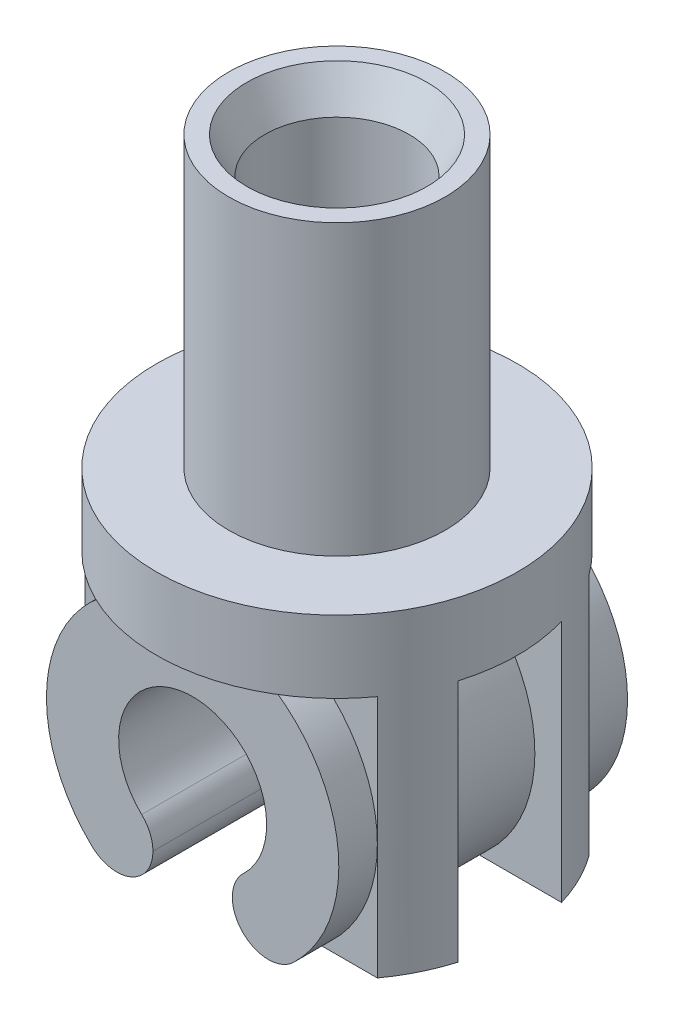
ISO-10303-21;
HEADER;
FILE_DESCRIPTION(('STEP AP214'),'2;1');
FILE_NAME('part.step','',(''),(''),'','','');
FILE_SCHEMA(('AUTOMOTIVE_DESIGN { 1 0 10303 214 1 1 1 1 }'));
ENDSEC;
DATA;
#1=APPLICATION_CONTEXT('core data for automotive mechanical design processes');
#2=APPLICATION_PROTOCOL_DEFINITION('international standard','automotive_design',2000,#1);
#3=PRODUCT_CONTEXT('',#1,'mechanical');
#4=PRODUCT('Part','Part','',(#3));
#5=PRODUCT_RELATED_PRODUCT_CATEGORY('part','',(#4));
#6=PRODUCT_DEFINITION_FORMATION('','',#4);
#7=PRODUCT_DEFINITION_CONTEXT('part definition',#1,'design');
#8=PRODUCT_DEFINITION('design','',#6,#7);
#9=PRODUCT_DEFINITION_SHAPE('','',#8);
#10=(LENGTH_UNIT() NAMED_UNIT(*) SI_UNIT(.MILLI.,.METRE.));
#11=(NAMED_UNIT(*) PLANE_ANGLE_UNIT() SI_UNIT($,.RADIAN.));
#12=(NAMED_UNIT(*) SI_UNIT($,.STERADIAN.) SOLID_ANGLE_UNIT());
#13=UNCERTAINTY_MEASURE_WITH_UNIT(LENGTH_MEASURE(1.E-05),#10,'distance_accuracy_value','');
#14=(GEOMETRIC_REPRESENTATION_CONTEXT(3) GLOBAL_UNCERTAINTY_ASSIGNED_CONTEXT((#13)) GLOBAL_UNIT_ASSIGNED_CONTEXT((#10,
#11,#12)) REPRESENTATION_CONTEXT('',''));
#15=CARTESIAN_POINT('',(0.,0.,0.));
#16=DIRECTION('',(0.,0.,1.));
#17=DIRECTION('',(1.,0.,0.));
#18=AXIS2_PLACEMENT_3D('',#15,#16,#17);
#19=CARTESIAN_POINT('',(3.927828813628,-7.7504869247949,6.62409702745333));
#20=DIRECTION('',(0.,0.,1.));
#21=DIRECTION('',(1.,0.,0.));
#22=AXIS2_PLACEMENT_3D('',#19,#20,#21);
#23=CYLINDRICAL_SURFACE('',#22,1.);
#24=CARTESIAN_POINT('',(3.927828813628,-7.7504869247949,20.1878195071953));
#25=DIRECTION('',(0.,0.,1.));
#26=DIRECTION('',(1.,0.,0.));
#27=AXIS2_PLACEMENT_3D('',#24,#25,#26);
#28=CIRCLE('',#27,1.);
#29=CARTESIAN_POINT('',(4.61635340379194,-8.47569992022423,20.1878195071953));
#30=VERTEX_POINT('',#29);
#31=CARTESIAN_POINT('',(3.92782881362801,-8.7504869247949,20.1878195071953));
#32=VERTEX_POINT('',#31);
#33=EDGE_CURVE('E298',#30,#32,#28,.F.);
#34=ORIENTED_EDGE('',*,*,#33,.F.);
#35=DIRECTION('',(0.,0.,1.));
#36=VECTOR('',#35,1.);
#37=CARTESIAN_POINT('',(4.61635340379194,-8.47569992022423,6.62409702745333));
#38=LINE('',#37,#36);
#39=CARTESIAN_POINT('',(4.61635340379194,-8.47569992022423,23.0521182717536));
#40=VERTEX_POINT('',#39);
#41=EDGE_CURVE('E480',#40,#30,#38,.F.);
#42=ORIENTED_EDGE('',*,*,#41,.F.);
#43=CARTESIAN_POINT('',(3.927828813628,-7.7504869247949,23.0521182717536));
#44=DIRECTION('',(0.,0.,1.));
#45=DIRECTION('',(1.,0.,0.));
#46=AXIS2_PLACEMENT_3D('',#43,#44,#45);
#47=CIRCLE('',#46,1.);
#48=CARTESIAN_POINT('',(3.92782881362801,-8.7504869247949,23.0521182717536));
#49=VERTEX_POINT('',#48);
#50=EDGE_CURVE('E315',#40,#49,#47,.F.);
#51=ORIENTED_EDGE('',*,*,#50,.T.);
#52=DIRECTION('',(0.,0.,1.));
#53=VECTOR('',#52,1.);
#54=CARTESIAN_POINT('',(3.92782881362801,-8.7504869247949,21.082852444629));
#55=LINE('',#54,#53);
#56=CARTESIAN_POINT('',(3.92782881362801,-8.7504869247949,24.5521182717536));
#57=VERTEX_POINT('',#56);
#58=EDGE_CURVE('E316',#49,#57,#55,.T.);
#59=ORIENTED_EDGE('',*,*,#58,.T.);
#60=CARTESIAN_POINT('',(3.927828813628,-7.7504869247949,24.5521182717536));
#61=DIRECTION('',(0.,0.,-1.));
#62=DIRECTION('',(-1.,0.,0.));
#63=AXIS2_PLACEMENT_3D('',#60,#61,#62);
#64=CIRCLE('',#63,1.);
#65=CARTESIAN_POINT('',(4.61635340379194,-8.47569992022423,24.5521182717536));
#66=VERTEX_POINT('',#65);
#67=EDGE_CURVE('E324',#57,#66,#64,.F.);
#68=ORIENTED_EDGE('',*,*,#67,.T.);
#69=CARTESIAN_POINT('',(4.61635340379194,-8.47569992022423,25.6199688894745));
#70=VERTEX_POINT('',#69);
#71=EDGE_CURVE('E478',#70,#66,#38,.F.);
#72=ORIENTED_EDGE('',*,*,#71,.F.);
#73=CARTESIAN_POINT('',(3.927828813628,-7.7504869247949,25.6199688894745));
#74=DIRECTION('',(0.,0.,1.));
#75=DIRECTION('',(1.,0.,0.));
#76=AXIS2_PLACEMENT_3D('',#73,#74,#75);
#77=CIRCLE('',#76,1.);
#78=CARTESIAN_POINT('',(2.927828813628,-7.7504869247949,25.6199688894745));
#79=VERTEX_POINT('',#78);
#80=EDGE_CURVE('E459',#79,#70,#77,.T.);
#81=ORIENTED_EDGE('',*,*,#80,.F.);
#82=DIRECTION('',(0.,0.,1.));
#83=VECTOR('',#82,1.);
#84=CARTESIAN_POINT('',(2.927828813628,-7.7504869247949,6.62409702745333));
#85=LINE('',#84,#83);
#86=CARTESIAN_POINT('',(2.927828813628,-7.7504869247949,17.6199688894745));
#87=VERTEX_POINT('',#86);
#88=EDGE_CURVE('E51',#87,#79,#85,.T.);
#89=ORIENTED_EDGE('',*,*,#88,.F.);
#90=CARTESIAN_POINT('',(3.927828813628,-7.7504869247949,17.6199688894745));
#91=DIRECTION('',(0.,0.,1.));
#92=DIRECTION('',(1.,0.,0.));
#93=AXIS2_PLACEMENT_3D('',#90,#91,#92);
#94=CIRCLE('',#93,1.);
#95=CARTESIAN_POINT('',(4.61635340379194,-8.47569992022423,17.6199688894745));
#96=VERTEX_POINT('',#95);
#97=EDGE_CURVE('E473',#96,#87,#94,.F.);
#98=ORIENTED_EDGE('',*,*,#97,.F.);
#99=CARTESIAN_POINT('',(4.61635340379194,-8.47569992022423,18.6878195071953));
#100=VERTEX_POINT('',#99);
#101=EDGE_CURVE('E477',#100,#96,#38,.F.);
#102=ORIENTED_EDGE('',*,*,#101,.F.);
#103=CARTESIAN_POINT('',(3.927828813628,-7.7504869247949,18.6878195071953));
#104=DIRECTION('',(0.,0.,1.));
#105=DIRECTION('',(1.,0.,0.));
#106=AXIS2_PLACEMENT_3D('',#103,#104,#105);
#107=CIRCLE('',#106,1.);
#108=CARTESIAN_POINT('',(3.92782881362801,-8.7504869247949,18.6878195071953));
#109=VERTEX_POINT('',#108);
#110=EDGE_CURVE('E288',#100,#109,#107,.F.);
#111=ORIENTED_EDGE('',*,*,#110,.T.);
#112=DIRECTION('',(0.,0.,1.));
#113=VECTOR('',#112,1.);
#114=CARTESIAN_POINT('',(3.92782881362801,-8.7504869247949,16.7185536800707));
#115=LINE('',#114,#113);
#116=EDGE_CURVE('E292',#109,#32,#115,.T.);
#117=ORIENTED_EDGE('',*,*,#116,.T.);
#118=EDGE_LOOP('',(#34,#42,#51,#59,#68,#72,#81,#89,#98,#102,#111,#117));
#119=FACE_BOUND('',#118,.T.);
#120=ADVANCED_FACE('F48',(#119),#23,.T.);
#121=CARTESIAN_POINT('',(1.827828813628,-5.53858728873544,6.62409702745333));
#122=DIRECTION('',(0.,0.,1.));
#123=DIRECTION('',(1.,0.,0.));
#124=AXIS2_PLACEMENT_3D('',#121,#122,#123);
#125=CYLINDRICAL_SURFACE('',#124,4.05);
#126=DIRECTION('',(0.,0.,1.));
#127=VECTOR('',#126,1.);
#128=CARTESIAN_POINT('',(-0.960695776535936,-8.47569992022423,6.62409702745333));
#129=LINE('',#128,#127);
#130=CARTESIAN_POINT('',(-0.960695776535935,-8.47569992022423,20.1878195071953));
#131=VERTEX_POINT('',#130);
#132=CARTESIAN_POINT('',(-0.960695776535935,-8.47569992022423,23.0521182717536));
#133=VERTEX_POINT('',#132);
#134=EDGE_CURVE('E56',#131,#133,#129,.T.);
#135=ORIENTED_EDGE('',*,*,#134,.T.);
#136=CARTESIAN_POINT('',(1.827828813628,-5.53858728873544,23.0521182717536));
#137=DIRECTION('',(0.,0.,1.));
#138=DIRECTION('',(1.,0.,0.));
#139=AXIS2_PLACEMENT_3D('',#136,#137,#138);
#140=CIRCLE('',#139,4.05);
#141=CARTESIAN_POINT('',(-0.142171186372,-2.,23.0521182717536));
#142=VERTEX_POINT('',#141);
#143=EDGE_CURVE('E389',#142,#133,#140,.T.);
#144=ORIENTED_EDGE('',*,*,#143,.F.);
#145=DIRECTION('',(0.,0.,-1.));
#146=VECTOR('',#145,1.);
#147=CARTESIAN_POINT('',(-0.142171186372,-2.,0.));
#148=LINE('',#147,#146);
#149=CARTESIAN_POINT('',(-0.142171186372,-2.,20.1878195071953));
#150=VERTEX_POINT('',#149);
#151=EDGE_CURVE('E444',#142,#150,#148,.T.);
#152=ORIENTED_EDGE('',*,*,#151,.T.);
#153=CARTESIAN_POINT('',(1.827828813628,-5.53858728873544,20.1878195071953));
#154=DIRECTION('',(0.,0.,1.));
#155=DIRECTION('',(1.,0.,0.));
#156=AXIS2_PLACEMENT_3D('',#153,#154,#155);
#157=CIRCLE('',#156,4.05);
#158=EDGE_CURVE('E378',#150,#131,#157,.T.);
#159=ORIENTED_EDGE('',*,*,#158,.T.);
#160=EDGE_LOOP('',(#135,#144,#152,#159));
#161=FACE_BOUND('',#160,.T.);
#162=ADVANCED_FACE('F520',(#161),#125,.T.);
#163=CARTESIAN_POINT('',(-0.960695776535936,-8.47569992022423,17.6199688894745));
#164=VERTEX_POINT('',#163);
#165=CARTESIAN_POINT('',(-0.960695776535935,-8.47569992022423,18.6878195071953));
#166=VERTEX_POINT('',#165);
#167=EDGE_CURVE('E13',#164,#166,#129,.T.);
#168=ORIENTED_EDGE('',*,*,#167,.T.);
#169=CARTESIAN_POINT('',(1.827828813628,-5.53858728873544,18.6878195071953));
#170=DIRECTION('',(0.,0.,1.));
#171=DIRECTION('',(1.,0.,0.));
#172=AXIS2_PLACEMENT_3D('',#169,#170,#171);
#173=CIRCLE('',#172,4.05);
#174=CARTESIAN_POINT('',(-2.222171186372,-5.53858728873544,18.6878195071953));
#175=VERTEX_POINT('',#174);
#176=EDGE_CURVE('E347',#166,#175,#173,.F.);
#177=ORIENTED_EDGE('',*,*,#176,.T.);
#178=CARTESIAN_POINT('',(1.827828813628,-5.53858728873544,18.6878195071953));
#179=DIRECTION('',(0.,0.,1.));
#180=DIRECTION('',(1.,0.,0.));
#181=AXIS2_PLACEMENT_3D('',#178,#179,#180);
#182=CIRCLE('',#181,4.05);
#183=CARTESIAN_POINT('',(-0.142171186372,-2.,18.6878195071953));
#184=VERTEX_POINT('',#183);
#185=EDGE_CURVE('E377',#184,#175,#182,.T.);
#186=ORIENTED_EDGE('',*,*,#185,.F.);
#187=CARTESIAN_POINT('',(-0.142171186372,-2.,17.6199688894745));
#188=VERTEX_POINT('',#187);
#189=EDGE_CURVE('E431',#184,#188,#148,.T.);
#190=ORIENTED_EDGE('',*,*,#189,.T.);
#191=CARTESIAN_POINT('',(1.827828813628,-5.53858728873544,17.6199688894745));
#192=DIRECTION('',(0.,0.,1.));
#193=DIRECTION('',(1.,0.,0.));
#194=AXIS2_PLACEMENT_3D('',#191,#192,#193);
#195=CIRCLE('',#194,4.05);
#196=EDGE_CURVE('E401',#164,#188,#195,.F.);
#197=ORIENTED_EDGE('',*,*,#196,.F.);
#198=EDGE_LOOP('',(#168,#177,#186,#190,#197));
#199=FACE_BOUND('',#198,.T.);
#200=ADVANCED_FACE('F537',(#199),#125,.T.);
#201=CARTESIAN_POINT('',(1.827828813628,-5.53858728873544,6.62409702745333));
#202=DIRECTION('',(0.,0.,1.));
#203=DIRECTION('',(1.,0.,0.));
#204=AXIS2_PLACEMENT_3D('',#201,#202,#203);
#205=CYLINDRICAL_SURFACE('',#204,2.05);
#206=CARTESIAN_POINT('',(1.827828813628,-5.53858728873544,25.6199688894745));
#207=DIRECTION('',(0.,0.,1.));
#208=DIRECTION('',(1.,0.,0.));
#209=AXIS2_PLACEMENT_3D('',#206,#207,#208);
#210=CIRCLE('',#209,2.05);
#211=CARTESIAN_POINT('',(3.23930422346407,-7.02527392936557,25.6199688894745));
#212=VERTEX_POINT('',#211);
#213=CARTESIAN_POINT('',(0.416353403791934,-7.02527392936557,25.6199688894745));
#214=VERTEX_POINT('',#213);
#215=EDGE_CURVE('E406',#212,#214,#210,.T.);
#216=ORIENTED_EDGE('',*,*,#215,.T.);
#217=DIRECTION('',(0.,0.,1.));
#218=VECTOR('',#217,1.);
#219=CARTESIAN_POINT('',(0.416353403791934,-7.02527392936557,6.62409702745333));
#220=LINE('',#219,#218);
#221=CARTESIAN_POINT('',(0.416353403791934,-7.02527392936557,17.6199688894745));
#222=VERTEX_POINT('',#221);
#223=EDGE_CURVE('E466',#214,#222,#220,.F.);
#224=ORIENTED_EDGE('',*,*,#223,.T.);
#225=CARTESIAN_POINT('',(1.827828813628,-5.53858728873544,17.6199688894745));
#226=DIRECTION('',(0.,0.,1.));
#227=DIRECTION('',(1.,0.,0.));
#228=AXIS2_PLACEMENT_3D('',#225,#226,#227);
#229=CIRCLE('',#228,2.05);
#230=CARTESIAN_POINT('',(3.23930422346407,-7.02527392936557,17.6199688894745));
#231=VERTEX_POINT('',#230);
#232=EDGE_CURVE('E402',#222,#231,#229,.F.);
#233=ORIENTED_EDGE('',*,*,#232,.T.);
#234=DIRECTION('',(0.,0.,1.));
#235=VECTOR('',#234,1.);
#236=CARTESIAN_POINT('',(3.23930422346407,-7.02527392936557,6.62409702745333));
#237=LINE('',#236,#235);
#238=EDGE_CURVE('E463',#231,#212,#237,.T.);
#239=ORIENTED_EDGE('',*,*,#238,.T.);
#240=EDGE_LOOP('',(#216,#224,#233,#239));
#241=FACE_BOUND('',#240,.T.);
#242=ADVANCED_FACE('F554',(#241),#205,.F.);
#243=CARTESIAN_POINT('',(1.827828813628,-5.53858728873544,6.62409702745333));
#244=DIRECTION('',(0.,0.,1.));
#245=DIRECTION('',(1.,0.,0.));
#246=AXIS2_PLACEMENT_3D('',#243,#244,#245);
#247=CYLINDRICAL_SURFACE('',#246,4.05);
#248=CARTESIAN_POINT('',(1.827828813628,-5.53858728873544,23.0521182717536));
#249=DIRECTION('',(0.,0.,1.));
#250=DIRECTION('',(1.,0.,0.));
#251=AXIS2_PLACEMENT_3D('',#248,#249,#250);
#252=CIRCLE('',#251,4.05);
#253=CARTESIAN_POINT('',(3.797828813628,-2.,23.0521182717536));
#254=VERTEX_POINT('',#253);
#255=EDGE_CURVE('E356',#40,#254,#252,.T.);
#256=ORIENTED_EDGE('',*,*,#255,.F.);
#257=ORIENTED_EDGE('',*,*,#41,.T.);
#258=CARTESIAN_POINT('',(1.827828813628,-5.53858728873544,20.1878195071953));
#259=DIRECTION('',(0.,0.,1.));
#260=DIRECTION('',(1.,0.,0.));
#261=AXIS2_PLACEMENT_3D('',#258,#259,#260);
#262=CIRCLE('',#261,4.05);
#263=CARTESIAN_POINT('',(3.797828813628,-2.,20.1878195071953));
#264=VERTEX_POINT('',#263);
#265=EDGE_CURVE('E362',#30,#264,#262,.T.);
#266=ORIENTED_EDGE('',*,*,#265,.T.);
#267=DIRECTION('',(0.,0.,-1.));
#268=VECTOR('',#267,1.);
#269=CARTESIAN_POINT('',(3.797828813628,-2.,0.));
#270=LINE('',#269,#268);
#271=EDGE_CURVE('E438',#254,#264,#270,.T.);
#272=ORIENTED_EDGE('',*,*,#271,.F.);
#273=EDGE_LOOP('',(#256,#257,#266,#272));
#274=FACE_BOUND('',#273,.T.);
#275=ADVANCED_FACE('F593',(#274),#247,.T.);
#276=CARTESIAN_POINT('',(1.827828813628,-5.53858728873544,18.6878195071953));
#277=DIRECTION('',(0.,0.,1.));
#278=DIRECTION('',(1.,0.,0.));
#279=AXIS2_PLACEMENT_3D('',#276,#277,#278);
#280=CIRCLE('',#279,4.05);
#281=CARTESIAN_POINT('',(5.877828813628,-5.53858728873544,18.6878195071953));
#282=VERTEX_POINT('',#281);
#283=CARTESIAN_POINT('',(3.797828813628,-2.,18.6878195071953));
#284=VERTEX_POINT('',#283);
#285=EDGE_CURVE('E370',#282,#284,#280,.T.);
#286=ORIENTED_EDGE('',*,*,#285,.F.);
#287=CARTESIAN_POINT('',(1.827828813628,-5.53858728873544,18.6878195071953));
#288=DIRECTION('',(0.,0.,1.));
#289=DIRECTION('',(1.,0.,0.));
#290=AXIS2_PLACEMENT_3D('',#287,#288,#289);
#291=CIRCLE('',#290,4.05);
#292=EDGE_CURVE('E341',#282,#100,#291,.F.);
#293=ORIENTED_EDGE('',*,*,#292,.T.);
#294=ORIENTED_EDGE('',*,*,#101,.T.);
#295=CARTESIAN_POINT('',(1.827828813628,-5.53858728873544,17.6199688894745));
#296=DIRECTION('',(0.,0.,1.));
#297=DIRECTION('',(1.,0.,0.));
#298=AXIS2_PLACEMENT_3D('',#295,#296,#297);
#299=CIRCLE('',#298,4.05);
#300=CARTESIAN_POINT('',(3.797828813628,-2.,17.6199688894745));
#301=VERTEX_POINT('',#300);
#302=EDGE_CURVE('E398',#301,#96,#299,.F.);
#303=ORIENTED_EDGE('',*,*,#302,.F.);
#304=EDGE_CURVE('E439',#284,#301,#270,.T.);
#305=ORIENTED_EDGE('',*,*,#304,.F.);
#306=EDGE_LOOP('',(#286,#293,#294,#303,#305));
#307=FACE_BOUND('',#306,.T.);
#308=ADVANCED_FACE('F551',(#307),#247,.T.);
#309=CARTESIAN_POINT('',(1.827828813628,-2.,21.6199688894745));
#310=DIRECTION('',(0.,1.,0.));
#311=DIRECTION('',(0.,0.,1.));
#312=AXIS2_PLACEMENT_3D('',#309,#310,#311);
#313=PLANE('',#312);
#314=DIRECTION('',(1.,0.,0.));
#315=VECTOR('',#314,1.);
#316=CARTESIAN_POINT('',(0.,-2.,18.6878195071953));
#317=LINE('',#316,#315);
#318=CARTESIAN_POINT('',(-2.222171186372,-2.,18.6878195071953));
#319=VERTEX_POINT('',#318);
#320=EDGE_CURVE('E352',#319,#184,#317,.T.);
#321=ORIENTED_EDGE('',*,*,#320,.F.);
#322=CARTESIAN_POINT('',(1.827828813628,-2.,21.6199688894745));
#323=DIRECTION('',(0.,1.,0.));
#324=DIRECTION('',(0.,0.,1.));
#325=AXIS2_PLACEMENT_3D('',#322,#323,#324);
#326=CIRCLE('',#325,5.);
#327=CARTESIAN_POINT('',(5.877828813628,-2.,18.6878195071953));
#328=VERTEX_POINT('',#327);
#329=EDGE_CURVE('E435',#328,#319,#326,.T.);
#330=ORIENTED_EDGE('',*,*,#329,.F.);
#331=DIRECTION('',(1.,0.,0.));
#332=VECTOR('',#331,1.);
#333=CARTESIAN_POINT('',(0.,-2.,18.6878195071953));
#334=LINE('',#333,#332);
#335=EDGE_CURVE('E366',#284,#328,#334,.T.);
#336=ORIENTED_EDGE('',*,*,#335,.F.);
#337=ORIENTED_EDGE('',*,*,#304,.T.);
#338=DIRECTION('',(1.,0.,0.));
#339=VECTOR('',#338,1.);
#340=CARTESIAN_POINT('',(0.,-2.,17.6199688894745));
#341=LINE('',#340,#339);
#342=EDGE_CURVE('E443',#188,#301,#341,.T.);
#343=ORIENTED_EDGE('',*,*,#342,.F.);
#344=ORIENTED_EDGE('',*,*,#189,.F.);
#345=EDGE_LOOP('',(#321,#330,#336,#337,#343,#344));
#346=FACE_BOUND('',#345,.T.);
#347=ADVANCED_FACE('F545',(#346),#313,.F.);
#348=DIRECTION('',(1.,0.,0.));
#349=VECTOR('',#348,1.);
#350=CARTESIAN_POINT('',(0.,-2.,23.0521182717536));
#351=LINE('',#350,#349);
#352=CARTESIAN_POINT('',(-2.96267722924862,-2.,23.0521182717536));
#353=VERTEX_POINT('',#352);
#354=EDGE_CURVE('E65',#353,#142,#351,.T.);
#355=ORIENTED_EDGE('',*,*,#354,.F.);
#356=CARTESIAN_POINT('',(-2.96267722924862,-2.,20.1878195071953));
#357=VERTEX_POINT('',#356);
#358=EDGE_CURVE('E433',#357,#353,#326,.T.);
#359=ORIENTED_EDGE('',*,*,#358,.F.);
#360=DIRECTION('',(1.,0.,0.));
#361=VECTOR('',#360,1.);
#362=CARTESIAN_POINT('',(0.,-2.,20.1878195071953));
#363=LINE('',#362,#361);
#364=EDGE_CURVE('E73',#357,#150,#363,.T.);
#365=ORIENTED_EDGE('',*,*,#364,.T.);
#366=ORIENTED_EDGE('',*,*,#151,.F.);
#367=EDGE_LOOP('',(#355,#359,#365,#366));
#368=FACE_BOUND('',#367,.T.);
#369=ADVANCED_FACE('F532',(#368),#313,.F.);
#370=DIRECTION('',(1.,0.,0.));
#371=VECTOR('',#370,1.);
#372=CARTESIAN_POINT('',(0.,-2.,20.1878195071953));
#373=LINE('',#372,#371);
#374=CARTESIAN_POINT('',(6.61833485650463,-2.,20.1878195071953));
#375=VERTEX_POINT('',#374);
#376=EDGE_CURVE('E371',#264,#375,#373,.T.);
#377=ORIENTED_EDGE('',*,*,#376,.T.);
#378=CARTESIAN_POINT('',(6.61833485650463,-2.,23.0521182717536));
#379=VERTEX_POINT('',#378);
#380=EDGE_CURVE('E432',#379,#375,#326,.T.);
#381=ORIENTED_EDGE('',*,*,#380,.F.);
#382=DIRECTION('',(1.,0.,0.));
#383=VECTOR('',#382,1.);
#384=CARTESIAN_POINT('',(0.,-2.,23.0521182717536));
#385=LINE('',#384,#383);
#386=EDGE_CURVE('E353',#254,#379,#385,.T.);
#387=ORIENTED_EDGE('',*,*,#386,.F.);
#388=ORIENTED_EDGE('',*,*,#271,.T.);
#389=EDGE_LOOP('',(#377,#381,#387,#388));
#390=FACE_BOUND('',#389,.T.);
#391=ADVANCED_FACE('F859',(#390),#313,.F.);
#392=CARTESIAN_POINT('',(0.,-2.,25.6199688894745));
#393=DIRECTION('',(0.,0.,1.));
#394=DIRECTION('',(1.,0.,0.));
#395=AXIS2_PLACEMENT_3D('',#392,#393,#394);
#396=PLANE('',#395);
#397=ORIENTED_EDGE('',*,*,#215,.F.);
#398=CARTESIAN_POINT('',(3.927828813628,-7.7504869247949,25.6199688894745));
#399=DIRECTION('',(0.,0.,1.));
#400=DIRECTION('',(1.,0.,0.));
#401=AXIS2_PLACEMENT_3D('',#398,#399,#400);
#402=CIRCLE('',#401,1.);
#403=EDGE_CURVE('E461',#212,#79,#402,.T.);
#404=ORIENTED_EDGE('',*,*,#403,.T.);
#405=ORIENTED_EDGE('',*,*,#80,.T.);
#406=CARTESIAN_POINT('',(1.827828813628,-5.53858728873544,25.6199688894745));
#407=DIRECTION('',(0.,0.,1.));
#408=DIRECTION('',(1.,0.,0.));
#409=AXIS2_PLACEMENT_3D('',#406,#407,#408);
#410=CIRCLE('',#409,4.05);
#411=CARTESIAN_POINT('',(3.797828813628,-2.,25.6199688894745));
#412=VERTEX_POINT('',#411);
#413=EDGE_CURVE('E409',#70,#412,#410,.T.);
#414=ORIENTED_EDGE('',*,*,#413,.T.);
#415=DIRECTION('',(1.,0.,0.));
#416=VECTOR('',#415,1.);
#417=CARTESIAN_POINT('',(0.,-2.,25.6199688894745));
#418=LINE('',#417,#416);
#419=CARTESIAN_POINT('',(-0.142171186372,-2.,25.6199688894745));
#420=VERTEX_POINT('',#419);
#421=EDGE_CURVE('E447',#420,#412,#418,.T.);
#422=ORIENTED_EDGE('',*,*,#421,.F.);
#423=CARTESIAN_POINT('',(1.827828813628,-5.53858728873544,25.6199688894745));
#424=DIRECTION('',(0.,0.,1.));
#425=DIRECTION('',(1.,0.,0.));
#426=AXIS2_PLACEMENT_3D('',#423,#424,#425);
#427=CIRCLE('',#426,4.05);
#428=CARTESIAN_POINT('',(-0.960695776535936,-8.47569992022423,25.6199688894745));
#429=VERTEX_POINT('',#428);
#430=EDGE_CURVE('E412',#420,#429,#427,.T.);
#431=ORIENTED_EDGE('',*,*,#430,.T.);
#432=CARTESIAN_POINT('',(-0.272171186372,-7.7504869247949,25.6199688894745));
#433=DIRECTION('',(0.,0.,1.));
#434=DIRECTION('',(1.,0.,0.));
#435=AXIS2_PLACEMENT_3D('',#432,#433,#434);
#436=CIRCLE('',#435,1.);
#437=CARTESIAN_POINT('',(0.727828813628,-7.7504869247949,25.6199688894745));
#438=VERTEX_POINT('',#437);
#439=EDGE_CURVE('E455',#429,#438,#436,.T.);
#440=ORIENTED_EDGE('',*,*,#439,.T.);
#441=CARTESIAN_POINT('',(-0.272171186372,-7.7504869247949,25.6199688894745));
#442=DIRECTION('',(0.,0.,1.));
#443=DIRECTION('',(1.,0.,0.));
#444=AXIS2_PLACEMENT_3D('',#441,#442,#443);
#445=CIRCLE('',#444,1.);
#446=EDGE_CURVE('E457',#438,#214,#445,.T.);
#447=ORIENTED_EDGE('',*,*,#446,.T.);
#448=EDGE_LOOP('',(#397,#404,#405,#414,#422,#431,#440,#447));
#449=FACE_BOUND('',#448,.T.);
#450=ADVANCED_FACE('F500',(#449),#396,.T.);
#451=CARTESIAN_POINT('',(0.,-8.3,17.6199688894745));
#452=DIRECTION('',(0.,0.,1.));
#453=DIRECTION('',(1.,0.,0.));
#454=AXIS2_PLACEMENT_3D('',#451,#452,#453);
#455=PLANE('',#454);
#456=ORIENTED_EDGE('',*,*,#97,.T.);
#457=CARTESIAN_POINT('',(3.927828813628,-7.7504869247949,17.6199688894745));
#458=DIRECTION('',(0.,0.,1.));
#459=DIRECTION('',(1.,0.,0.));
#460=AXIS2_PLACEMENT_3D('',#457,#458,#459);
#461=CIRCLE('',#460,1.);
#462=EDGE_CURVE('E475',#87,#231,#461,.F.);
#463=ORIENTED_EDGE('',*,*,#462,.T.);
#464=ORIENTED_EDGE('',*,*,#232,.F.);
#465=CARTESIAN_POINT('',(-0.272171186372,-7.7504869247949,17.6199688894745));
#466=DIRECTION('',(0.,0.,1.));
#467=DIRECTION('',(1.,0.,0.));
#468=AXIS2_PLACEMENT_3D('',#465,#466,#467);
#469=CIRCLE('',#468,1.);
#470=CARTESIAN_POINT('',(0.727828813628,-7.7504869247949,17.6199688894745));
#471=VERTEX_POINT('',#470);
#472=EDGE_CURVE('E471',#222,#471,#469,.F.);
#473=ORIENTED_EDGE('',*,*,#472,.T.);
#474=CARTESIAN_POINT('',(-0.272171186372,-7.7504869247949,17.6199688894745));
#475=DIRECTION('',(0.,0.,1.));
#476=DIRECTION('',(1.,0.,0.));
#477=AXIS2_PLACEMENT_3D('',#474,#475,#476);
#478=CIRCLE('',#477,1.);
#479=EDGE_CURVE('E469',#471,#164,#478,.F.);
#480=ORIENTED_EDGE('',*,*,#479,.T.);
#481=ORIENTED_EDGE('',*,*,#196,.T.);
#482=ORIENTED_EDGE('',*,*,#342,.T.);
#483=ORIENTED_EDGE('',*,*,#302,.T.);
#484=EDGE_LOOP('',(#456,#463,#464,#473,#480,#481,#482,#483));
#485=FACE_BOUND('',#484,.T.);
#486=ADVANCED_FACE('F543',(#485),#455,.F.);
#487=CARTESIAN_POINT('',(3.797828813628,-2.,24.5521182717536));
#488=VERTEX_POINT('',#487);
#489=EDGE_CURVE('E427',#412,#488,#270,.T.);
#490=ORIENTED_EDGE('',*,*,#489,.T.);
#491=DIRECTION('',(1.,0.,0.));
#492=VECTOR('',#491,1.);
#493=CARTESIAN_POINT('',(0.,-2.,24.5521182717536));
#494=LINE('',#493,#492);
#495=CARTESIAN_POINT('',(5.877828813628,-2.,24.5521182717536));
#496=VERTEX_POINT('',#495);
#497=EDGE_CURVE('E355',#488,#496,#494,.T.);
#498=ORIENTED_EDGE('',*,*,#497,.T.);
#499=CARTESIAN_POINT('',(-2.222171186372,-2.,24.5521182717536));
#500=VERTEX_POINT('',#499);
#501=EDGE_CURVE('E422',#500,#496,#326,.T.);
#502=ORIENTED_EDGE('',*,*,#501,.F.);
#503=DIRECTION('',(1.,0.,0.));
#504=VECTOR('',#503,1.);
#505=CARTESIAN_POINT('',(0.,-2.,24.5521182717536));
#506=LINE('',#505,#504);
#507=CARTESIAN_POINT('',(-0.142171186372,-2.,24.5521182717536));
#508=VERTEX_POINT('',#507);
#509=EDGE_CURVE('E393',#500,#508,#506,.T.);
#510=ORIENTED_EDGE('',*,*,#509,.T.);
#511=EDGE_CURVE('E440',#420,#508,#148,.T.);
#512=ORIENTED_EDGE('',*,*,#511,.F.);
#513=ORIENTED_EDGE('',*,*,#421,.T.);
#514=EDGE_LOOP('',(#490,#498,#502,#510,#512,#513));
#515=FACE_BOUND('',#514,.T.);
#516=ADVANCED_FACE('F509',(#515),#313,.F.);
#517=CARTESIAN_POINT('',(1.827828813628,0.,21.6199688894745));
#518=DIRECTION('',(0.,-1.,0.));
#519=DIRECTION('',(0.,0.,-1.));
#520=AXIS2_PLACEMENT_3D('',#517,#518,#519);
#521=CYLINDRICAL_SURFACE('',#520,5.);
#522=CARTESIAN_POINT('',(1.827828813628,0.,21.6199688894745));
#523=DIRECTION('',(0.,1.,0.));
#524=DIRECTION('',(0.,0.,1.));
#525=AXIS2_PLACEMENT_3D('',#522,#523,#524);
#526=CIRCLE('',#525,5.);
#527=CARTESIAN_POINT('',(1.827828813628,0.,26.6199688894745));
#528=VERTEX_POINT('',#527);
#529=EDGE_CURVE('E428',#528,#528,#526,.T.);
#530=ORIENTED_EDGE('',*,*,#529,.F.);
#531=EDGE_LOOP('',(#530));
#532=FACE_BOUND('',#531,.T.);
#533=ORIENTED_EDGE('',*,*,#501,.T.);
#534=DIRECTION('',(0.,1.,0.));
#535=VECTOR('',#534,1.);
#536=CARTESIAN_POINT('',(5.877828813628,-9.07717457747087,24.5521182717536));
#537=LINE('',#536,#535);
#538=CARTESIAN_POINT('',(5.877828813628,-5.53858728873544,24.5521182717536));
#539=VERTEX_POINT('',#538);
#540=EDGE_CURVE('E359',#539,#496,#537,.T.);
#541=ORIENTED_EDGE('',*,*,#540,.F.);
#542=DIRECTION('',(0.,1.,0.));
#543=VECTOR('',#542,1.);
#544=CARTESIAN_POINT('',(5.877828813628,-8.47569992022423,24.5521182717536));
#545=LINE('',#544,#543);
#546=CARTESIAN_POINT('',(5.877828813628,-8.7504869247949,24.5521182717536));
#547=VERTEX_POINT('',#546);
#548=EDGE_CURVE('E335',#547,#539,#545,.T.);
#549=ORIENTED_EDGE('',*,*,#548,.F.);
#550=CARTESIAN_POINT('',(1.827828813628,-8.7504869247949,21.6199688894745));
#551=DIRECTION('',(0.,-1.,0.));
#552=DIRECTION('',(0.,0.,1.));
#553=AXIS2_PLACEMENT_3D('',#550,#551,#552);
#554=CIRCLE('',#553,5.);
#555=CARTESIAN_POINT('',(6.61833485650463,-8.7504869247949,23.0521182717536));
#556=VERTEX_POINT('',#555);
#557=EDGE_CURVE('E278',#556,#547,#554,.T.);
#558=ORIENTED_EDGE('',*,*,#557,.F.);
#559=DIRECTION('',(0.,-1.,0.));
#560=VECTOR('',#559,1.);
#561=CARTESIAN_POINT('',(6.61833485650463,-0.327173290643407,23.0521182717536));
#562=LINE('',#561,#560);
#563=EDGE_CURVE('E283',#379,#556,#562,.T.);
#564=ORIENTED_EDGE('',*,*,#563,.F.);
#565=ORIENTED_EDGE('',*,*,#380,.T.);
#566=DIRECTION('',(0.,-1.,0.));
#567=VECTOR('',#566,1.);
#568=CARTESIAN_POINT('',(6.61833485650463,-0.327173290643407,20.1878195071953));
#569=LINE('',#568,#567);
#570=CARTESIAN_POINT('',(6.61833485650463,-8.7504869247949,20.1878195071953));
#571=VERTEX_POINT('',#570);
#572=EDGE_CURVE('E273',#375,#571,#569,.T.);
#573=ORIENTED_EDGE('',*,*,#572,.T.);
#574=CARTESIAN_POINT('',(1.827828813628,-8.7504869247949,21.6199688894745));
#575=DIRECTION('',(0.,-1.,0.));
#576=DIRECTION('',(0.,0.,-1.));
#577=AXIS2_PLACEMENT_3D('',#574,#575,#576);
#578=CIRCLE('',#577,5.);
#579=CARTESIAN_POINT('',(5.877828813628,-8.7504869247949,18.6878195071953));
#580=VERTEX_POINT('',#579);
#581=EDGE_CURVE('E276',#580,#571,#578,.T.);
#582=ORIENTED_EDGE('',*,*,#581,.F.);
#583=DIRECTION('',(0.,1.,0.));
#584=VECTOR('',#583,1.);
#585=CARTESIAN_POINT('',(5.877828813628,-8.47569992022423,18.6878195071953));
#586=LINE('',#585,#584);
#587=EDGE_CURVE('E333',#580,#282,#586,.T.);
#588=ORIENTED_EDGE('',*,*,#587,.T.);
#589=DIRECTION('',(0.,1.,0.));
#590=VECTOR('',#589,1.);
#591=CARTESIAN_POINT('',(5.877828813628,-9.07717457747087,18.6878195071953));
#592=LINE('',#591,#590);
#593=EDGE_CURVE('E369',#282,#328,#592,.T.);
#594=ORIENTED_EDGE('',*,*,#593,.T.);
#595=ORIENTED_EDGE('',*,*,#329,.T.);
#596=DIRECTION('',(0.,1.,0.));
#597=VECTOR('',#596,1.);
#598=CARTESIAN_POINT('',(-2.222171186372,-9.07717457747087,18.6878195071953));
#599=LINE('',#598,#597);
#600=EDGE_CURVE('E380',#175,#319,#599,.T.);
#601=ORIENTED_EDGE('',*,*,#600,.F.);
#602=DIRECTION('',(0.,1.,0.));
#603=VECTOR('',#602,1.);
#604=CARTESIAN_POINT('',(-2.222171186372,-8.47569992022423,18.6878195071953));
#605=LINE('',#604,#603);
#606=CARTESIAN_POINT('',(-2.222171186372,-8.7504869247949,18.6878195071953));
#607=VERTEX_POINT('',#606);
#608=EDGE_CURVE('E266',#607,#175,#605,.T.);
#609=ORIENTED_EDGE('',*,*,#608,.F.);
#610=CARTESIAN_POINT('',(1.827828813628,-8.7504869247949,21.6199688894745));
#611=DIRECTION('',(0.,-1.,0.));
#612=DIRECTION('',(0.,0.,-1.));
#613=AXIS2_PLACEMENT_3D('',#610,#611,#612);
#614=CIRCLE('',#613,5.);
#615=CARTESIAN_POINT('',(-2.96267722924862,-8.7504869247949,20.1878195071953));
#616=VERTEX_POINT('',#615);
#617=EDGE_CURVE('E252',#616,#607,#614,.T.);
#618=ORIENTED_EDGE('',*,*,#617,.F.);
#619=DIRECTION('',(0.,-1.,0.));
#620=VECTOR('',#619,1.);
#621=CARTESIAN_POINT('',(-2.96267722924862,-0.327173290643407,20.1878195071953));
#622=LINE('',#621,#620);
#623=EDGE_CURVE('E258',#357,#616,#622,.T.);
#624=ORIENTED_EDGE('',*,*,#623,.F.);
#625=ORIENTED_EDGE('',*,*,#358,.T.);
#626=DIRECTION('',(0.,-1.,0.));
#627=VECTOR('',#626,1.);
#628=CARTESIAN_POINT('',(-2.96267722924862,-0.327173290643407,23.0521182717536));
#629=LINE('',#628,#627);
#630=CARTESIAN_POINT('',(-2.96267722924862,-8.7504869247949,23.0521182717536));
#631=VERTEX_POINT('',#630);
#632=EDGE_CURVE('E267',#353,#631,#629,.T.);
#633=ORIENTED_EDGE('',*,*,#632,.T.);
#634=CARTESIAN_POINT('',(1.827828813628,-8.7504869247949,21.6199688894745));
#635=DIRECTION('',(0.,-1.,0.));
#636=DIRECTION('',(0.,0.,-1.));
#637=AXIS2_PLACEMENT_3D('',#634,#635,#636);
#638=CIRCLE('',#637,5.);
#639=CARTESIAN_POINT('',(-2.222171186372,-8.7504869247949,24.5521182717536));
#640=VERTEX_POINT('',#639);
#641=EDGE_CURVE('E270',#640,#631,#638,.T.);
#642=ORIENTED_EDGE('',*,*,#641,.F.);
#643=DIRECTION('',(0.,1.,0.));
#644=VECTOR('',#643,1.);
#645=CARTESIAN_POINT('',(-2.222171186372,-8.47569992022423,24.5521182717536));
#646=LINE('',#645,#644);
#647=CARTESIAN_POINT('',(-2.222171186372,-5.53858728873544,24.5521182717536));
#648=VERTEX_POINT('',#647);
#649=EDGE_CURVE('E332',#640,#648,#646,.T.);
#650=ORIENTED_EDGE('',*,*,#649,.T.);
#651=DIRECTION('',(0.,1.,0.));
#652=VECTOR('',#651,1.);
#653=CARTESIAN_POINT('',(-2.222171186372,-9.07717457747087,24.5521182717536));
#654=LINE('',#653,#652);
#655=EDGE_CURVE('E390',#648,#500,#654,.T.);
#656=ORIENTED_EDGE('',*,*,#655,.T.);
#657=EDGE_LOOP('',(#533,#541,#549,#558,#564,#565,#573,#582,#588,#594,#595,#601,#609,#618,#624,
#625,#633,#642,#650,#656));
#658=FACE_BOUND('',#657,.T.);
#659=ADVANCED_FACE('F264',(#532,#658),#521,.T.);
#660=CARTESIAN_POINT('',(1.827828813628,0.,21.6199688894745));
#661=DIRECTION('',(0.,1.,0.));
#662=DIRECTION('',(0.,0.,1.));
#663=AXIS2_PLACEMENT_3D('',#660,#661,#662);
#664=PLANE('',#663);
#665=CARTESIAN_POINT('',(1.827828813628,0.,21.6199688894745));
#666=DIRECTION('',(0.,1.,0.));
#667=DIRECTION('',(0.,0.,1.));
#668=AXIS2_PLACEMENT_3D('',#665,#666,#667);
#669=CIRCLE('',#668,3.);
#670=CARTESIAN_POINT('',(1.827828813628,0.,24.6199688894745));
#671=VERTEX_POINT('',#670);
#672=EDGE_CURVE('E423',#671,#671,#669,.T.);
#673=ORIENTED_EDGE('',*,*,#672,.F.);
#674=EDGE_LOOP('',(#673));
#675=FACE_BOUND('',#674,.T.);
#676=ORIENTED_EDGE('',*,*,#529,.T.);
#677=EDGE_LOOP('',(#676));
#678=FACE_BOUND('',#677,.T.);
#679=ADVANCED_FACE('F839',(#675,#678),#664,.T.);
#680=CARTESIAN_POINT('',(1.827828813628,8.,21.6199688894745));
#681=DIRECTION('',(0.,-1.,0.));
#682=DIRECTION('',(0.,0.,-1.));
#683=AXIS2_PLACEMENT_3D('',#680,#681,#682);
#684=CYLINDRICAL_SURFACE('',#683,3.);
#685=CARTESIAN_POINT('',(1.827828813628,8.,21.6199688894745));
#686=DIRECTION('',(0.,1.,0.));
#687=DIRECTION('',(0.,0.,1.));
#688=AXIS2_PLACEMENT_3D('',#685,#686,#687);
#689=CIRCLE('',#688,3.);
#690=CARTESIAN_POINT('',(1.827828813628,8.,24.6199688894745));
#691=VERTEX_POINT('',#690);
#692=EDGE_CURVE('E419',#691,#691,#689,.T.);
#693=ORIENTED_EDGE('',*,*,#692,.F.);
#694=EDGE_LOOP('',(#693));
#695=FACE_BOUND('',#694,.T.);
#696=ORIENTED_EDGE('',*,*,#672,.T.);
#697=EDGE_LOOP('',(#696));
#698=FACE_BOUND('',#697,.T.);
#699=ADVANCED_FACE('F977',(#695,#698),#684,.T.);
#700=CARTESIAN_POINT('',(1.827828813628,8.,21.6199688894745));
#701=DIRECTION('',(0.,1.,0.));
#702=DIRECTION('',(0.,0.,1.));
#703=AXIS2_PLACEMENT_3D('',#700,#701,#702);
#704=PLANE('',#703);
#705=CARTESIAN_POINT('',(1.827828813628,8.,21.6199688894745));
#706=DIRECTION('',(0.,1.,0.));
#707=DIRECTION('',(0.,0.,1.));
#708=AXIS2_PLACEMENT_3D('',#705,#706,#707);
#709=CIRCLE('',#708,2.50000000000001);
#710=CARTESIAN_POINT('',(1.827828813628,8.,24.1199688894745));
#711=VERTEX_POINT('',#710);
#712=EDGE_CURVE('E452',#711,#711,#709,.F.);
#713=ORIENTED_EDGE('',*,*,#712,.T.);
#714=EDGE_LOOP('',(#713));
#715=FACE_BOUND('',#714,.T.);
#716=ORIENTED_EDGE('',*,*,#692,.T.);
#717=EDGE_LOOP('',(#716));
#718=FACE_BOUND('',#717,.T.);
#719=ADVANCED_FACE('F968',(#715,#718),#704,.T.);
#720=CARTESIAN_POINT('',(1.827828813628,-5.65685424949238,21.6199688894745));
#721=DIRECTION('',(0.,1.,0.));
#722=DIRECTION('',(0.,0.,1.));
#723=AXIS2_PLACEMENT_3D('',#720,#721,#722);
#724=CYLINDRICAL_SURFACE('',#723,2.);
#725=CARTESIAN_POINT('',(1.827828813628,6.99999999999999,21.6199688894745));
#726=DIRECTION('',(0.,1.,0.));
#727=DIRECTION('',(0.,0.,1.));
#728=AXIS2_PLACEMENT_3D('',#725,#726,#727);
#729=CIRCLE('',#728,2.);
#730=CARTESIAN_POINT('',(1.827828813628,6.99999999999999,23.6199688894745));
#731=VERTEX_POINT('',#730);
#732=EDGE_CURVE('E426',#731,#731,#729,.T.);
#733=ORIENTED_EDGE('',*,*,#732,.T.);
#734=EDGE_LOOP('',(#733));
#735=FACE_BOUND('',#734,.T.);
#736=CARTESIAN_POINT('',(1.827828813628,0.,21.6199688894745));
#737=DIRECTION('',(0.,1.,0.));
#738=DIRECTION('',(0.,0.,1.));
#739=AXIS2_PLACEMENT_3D('',#736,#737,#738);
#740=CIRCLE('',#739,2.);
#741=CARTESIAN_POINT('',(1.827828813628,0.,23.6199688894745));
#742=VERTEX_POINT('',#741);
#743=EDGE_CURVE('E405',#742,#742,#740,.F.);
#744=ORIENTED_EDGE('',*,*,#743,.T.);
#745=EDGE_LOOP('',(#744));
#746=FACE_BOUND('',#745,.T.);
#747=ADVANCED_FACE('F603',(#735,#746),#724,.F.);
#748=CARTESIAN_POINT('',(1.827828813628,0.,21.6199688894745));
#749=DIRECTION('',(0.,1.,0.));
#750=DIRECTION('',(0.,0.,1.));
#751=AXIS2_PLACEMENT_3D('',#748,#749,#750);
#752=PLANE('',#751);
#753=ORIENTED_EDGE('',*,*,#743,.F.);
#754=EDGE_LOOP('',(#753));
#755=FACE_BOUND('',#754,.T.);
#756=ADVANCED_FACE('F595',(#755),#752,.T.);
#757=CARTESIAN_POINT('',(1.827828813628,6.99999999999999,21.6199688894745));
#758=DIRECTION('',(0.,1.,0.));
#759=DIRECTION('',(0.,0.,1.));
#760=AXIS2_PLACEMENT_3D('',#757,#758,#759);
#761=CONICAL_SURFACE('',#760,2.,0.463647609000806);
#762=ORIENTED_EDGE('',*,*,#712,.F.);
#763=EDGE_LOOP('',(#762));
#764=FACE_BOUND('',#763,.T.);
#765=ORIENTED_EDGE('',*,*,#732,.F.);
#766=EDGE_LOOP('',(#765));
#767=FACE_BOUND('',#766,.T.);
#768=ADVANCED_FACE('F588',(#764,#767),#761,.F.);
#769=CARTESIAN_POINT('',(1.827828813628,-5.53858728873544,24.5521182717536));
#770=DIRECTION('',(0.,0.,1.));
#771=DIRECTION('',(1.,0.,0.));
#772=AXIS2_PLACEMENT_3D('',#769,#770,#771);
#773=CIRCLE('',#772,4.05);
#774=CARTESIAN_POINT('',(-0.960695776535935,-8.47569992022423,24.5521182717536));
#775=VERTEX_POINT('',#774);
#776=EDGE_CURVE('E350',#775,#648,#773,.F.);
#777=ORIENTED_EDGE('',*,*,#776,.F.);
#778=EDGE_CURVE('E58',#775,#429,#129,.T.);
#779=ORIENTED_EDGE('',*,*,#778,.T.);
#780=ORIENTED_EDGE('',*,*,#430,.F.);
#781=ORIENTED_EDGE('',*,*,#511,.T.);
#782=CARTESIAN_POINT('',(1.827828813628,-5.53858728873544,24.5521182717536));
#783=DIRECTION('',(0.,0.,1.));
#784=DIRECTION('',(1.,0.,0.));
#785=AXIS2_PLACEMENT_3D('',#782,#783,#784);
#786=CIRCLE('',#785,4.05);
#787=EDGE_CURVE('E386',#508,#648,#786,.T.);
#788=ORIENTED_EDGE('',*,*,#787,.T.);
#789=EDGE_LOOP('',(#777,#779,#780,#781,#788));
#790=FACE_BOUND('',#789,.T.);
#791=ADVANCED_FACE('F513',(#790),#125,.T.);
#792=CARTESIAN_POINT('',(1.827828813628,-5.53858728873544,24.5521182717536));
#793=DIRECTION('',(0.,0.,1.));
#794=DIRECTION('',(1.,0.,0.));
#795=AXIS2_PLACEMENT_3D('',#792,#793,#794);
#796=CIRCLE('',#795,4.05);
#797=EDGE_CURVE('E344',#539,#66,#796,.F.);
#798=ORIENTED_EDGE('',*,*,#797,.F.);
#799=CARTESIAN_POINT('',(1.827828813628,-5.53858728873544,24.5521182717536));
#800=DIRECTION('',(0.,0.,1.));
#801=DIRECTION('',(1.,0.,0.));
#802=AXIS2_PLACEMENT_3D('',#799,#800,#801);
#803=CIRCLE('',#802,4.05);
#804=EDGE_CURVE('E358',#539,#488,#803,.T.);
#805=ORIENTED_EDGE('',*,*,#804,.T.);
#806=ORIENTED_EDGE('',*,*,#489,.F.);
#807=ORIENTED_EDGE('',*,*,#413,.F.);
#808=ORIENTED_EDGE('',*,*,#71,.T.);
#809=EDGE_LOOP('',(#798,#805,#806,#807,#808));
#810=FACE_BOUND('',#809,.T.);
#811=ADVANCED_FACE('F505',(#810),#247,.T.);
#812=CARTESIAN_POINT('',(-0.272171186372,-7.7504869247949,6.62409702745333));
#813=DIRECTION('',(0.,0.,1.));
#814=DIRECTION('',(1.,0.,0.));
#815=AXIS2_PLACEMENT_3D('',#812,#813,#814);
#816=CYLINDRICAL_SURFACE('',#815,1.);
#817=CARTESIAN_POINT('',(-0.272171186372,-7.7504869247949,20.1878195071953));
#818=DIRECTION('',(0.,0.,1.));
#819=DIRECTION('',(1.,0.,0.));
#820=AXIS2_PLACEMENT_3D('',#817,#818,#819);
#821=CIRCLE('',#820,1.);
#822=CARTESIAN_POINT('',(-0.272171186372,-8.7504869247949,20.1878195071953));
#823=VERTEX_POINT('',#822);
#824=EDGE_CURVE('E303',#823,#131,#821,.F.);
#825=ORIENTED_EDGE('',*,*,#824,.F.);
#826=DIRECTION('',(0.,0.,1.));
#827=VECTOR('',#826,1.);
#828=CARTESIAN_POINT('',(-0.27217118637199,-8.7504869247949,16.7185536800707));
#829=LINE('',#828,#827);
#830=CARTESIAN_POINT('',(-0.272171186372,-8.7504869247949,18.6878195071953));
#831=VERTEX_POINT('',#830);
#832=EDGE_CURVE('E253',#831,#823,#829,.T.);
#833=ORIENTED_EDGE('',*,*,#832,.F.);
#834=CARTESIAN_POINT('',(-0.272171186372,-7.7504869247949,18.6878195071953));
#835=DIRECTION('',(0.,0.,1.));
#836=DIRECTION('',(1.,0.,0.));
#837=AXIS2_PLACEMENT_3D('',#834,#835,#836);
#838=CIRCLE('',#837,1.);
#839=EDGE_CURVE('E300',#831,#166,#838,.F.);
#840=ORIENTED_EDGE('',*,*,#839,.T.);
#841=ORIENTED_EDGE('',*,*,#167,.F.);
#842=ORIENTED_EDGE('',*,*,#479,.F.);
#843=DIRECTION('',(0.,0.,-1.));
#844=VECTOR('',#843,1.);
#845=CARTESIAN_POINT('',(0.727828813628,-7.7504869247949,17.6199688894745));
#846=LINE('',#845,#844);
#847=EDGE_CURVE('E410',#438,#471,#846,.T.);
#848=ORIENTED_EDGE('',*,*,#847,.F.);
#849=ORIENTED_EDGE('',*,*,#439,.F.);
#850=ORIENTED_EDGE('',*,*,#778,.F.);
#851=CARTESIAN_POINT('',(-0.272171186372,-7.7504869247949,24.5521182717536));
#852=DIRECTION('',(0.,0.,1.));
#853=DIRECTION('',(1.,0.,0.));
#854=AXIS2_PLACEMENT_3D('',#851,#852,#853);
#855=CIRCLE('',#854,1.);
#856=CARTESIAN_POINT('',(-0.272171186372,-8.7504869247949,24.5521182717536));
#857=VERTEX_POINT('',#856);
#858=EDGE_CURVE('E329',#857,#775,#855,.F.);
#859=ORIENTED_EDGE('',*,*,#858,.F.);
#860=DIRECTION('',(0.,0.,1.));
#861=VECTOR('',#860,1.);
#862=CARTESIAN_POINT('',(-0.27217118637199,-8.7504869247949,21.082852444629));
#863=LINE('',#862,#861);
#864=CARTESIAN_POINT('',(-0.272171186372,-8.7504869247949,23.0521182717536));
#865=VERTEX_POINT('',#864);
#866=EDGE_CURVE('E309',#865,#857,#863,.T.);
#867=ORIENTED_EDGE('',*,*,#866,.F.);
#868=CARTESIAN_POINT('',(-0.272171186372,-7.7504869247949,23.0521182717536));
#869=DIRECTION('',(0.,0.,1.));
#870=DIRECTION('',(1.,0.,0.));
#871=AXIS2_PLACEMENT_3D('',#868,#869,#870);
#872=CIRCLE('',#871,1.);
#873=EDGE_CURVE('E326',#865,#133,#872,.F.);
#874=ORIENTED_EDGE('',*,*,#873,.T.);
#875=ORIENTED_EDGE('',*,*,#134,.F.);
#876=EDGE_LOOP('',(#825,#833,#840,#841,#842,#848,#849,#850,#859,#867,#874,#875));
#877=FACE_BOUND('',#876,.T.);
#878=ADVANCED_FACE('F523',(#877),#816,.T.);
#879=CARTESIAN_POINT('',(-0.272171186372,-7.7504869247949,6.62409702745333));
#880=DIRECTION('',(0.,0.,1.));
#881=DIRECTION('',(1.,0.,0.));
#882=AXIS2_PLACEMENT_3D('',#879,#880,#881);
#883=CYLINDRICAL_SURFACE('',#882,1.);
#884=ORIENTED_EDGE('',*,*,#472,.F.);
#885=ORIENTED_EDGE('',*,*,#223,.F.);
#886=ORIENTED_EDGE('',*,*,#446,.F.);
#887=ORIENTED_EDGE('',*,*,#847,.T.);
#888=EDGE_LOOP('',(#884,#885,#886,#887));
#889=FACE_BOUND('',#888,.T.);
#890=ADVANCED_FACE('F556',(#889),#883,.T.);
#891=CARTESIAN_POINT('',(3.927828813628,-7.7504869247949,6.62409702745333));
#892=DIRECTION('',(0.,0.,1.));
#893=DIRECTION('',(1.,0.,0.));
#894=AXIS2_PLACEMENT_3D('',#891,#892,#893);
#895=CYLINDRICAL_SURFACE('',#894,1.);
#896=ORIENTED_EDGE('',*,*,#462,.F.);
#897=ORIENTED_EDGE('',*,*,#88,.T.);
#898=ORIENTED_EDGE('',*,*,#403,.F.);
#899=ORIENTED_EDGE('',*,*,#238,.F.);
#900=EDGE_LOOP('',(#896,#897,#898,#899));
#901=FACE_BOUND('',#900,.T.);
#902=ADVANCED_FACE('F489',(#901),#895,.T.);
#903=CARTESIAN_POINT('',(0.,-9.07717457747087,24.5521182717536));
#904=DIRECTION('',(0.,0.,1.));
#905=DIRECTION('',(1.,0.,0.));
#906=AXIS2_PLACEMENT_3D('',#903,#904,#905);
#907=PLANE('',#906);
#908=ORIENTED_EDGE('',*,*,#804,.F.);
#909=ORIENTED_EDGE('',*,*,#540,.T.);
#910=ORIENTED_EDGE('',*,*,#497,.F.);
#911=EDGE_LOOP('',(#908,#909,#910));
#912=FACE_BOUND('',#911,.T.);
#913=ADVANCED_FACE('F617',(#912),#907,.T.);
#914=CARTESIAN_POINT('',(0.,-9.07717457747087,23.0521182717536));
#915=DIRECTION('',(0.,0.,1.));
#916=DIRECTION('',(1.,0.,0.));
#917=AXIS2_PLACEMENT_3D('',#914,#915,#916);
#918=PLANE('',#917);
#919=ORIENTED_EDGE('',*,*,#386,.T.);
#920=ORIENTED_EDGE('',*,*,#563,.T.);
#921=DIRECTION('',(-1.,0.,0.));
#922=VECTOR('',#921,1.);
#923=CARTESIAN_POINT('',(5.877828813628,-8.7504869247949,23.0521182717536));
#924=LINE('',#923,#922);
#925=EDGE_CURVE('E305',#556,#49,#924,.T.);
#926=ORIENTED_EDGE('',*,*,#925,.T.);
#927=ORIENTED_EDGE('',*,*,#50,.F.);
#928=ORIENTED_EDGE('',*,*,#255,.T.);
#929=EDGE_LOOP('',(#919,#920,#926,#927,#928));
#930=FACE_BOUND('',#929,.T.);
#931=ADVANCED_FACE('F621',(#930),#918,.F.);
#932=CARTESIAN_POINT('',(0.,-9.07717457747087,20.1878195071953));
#933=DIRECTION('',(0.,0.,1.));
#934=DIRECTION('',(1.,0.,0.));
#935=AXIS2_PLACEMENT_3D('',#932,#933,#934);
#936=PLANE('',#935);
#937=ORIENTED_EDGE('',*,*,#265,.F.);
#938=ORIENTED_EDGE('',*,*,#33,.T.);
#939=DIRECTION('',(1.,0.,0.));
#940=VECTOR('',#939,1.);
#941=CARTESIAN_POINT('',(0.,-8.7504869247949,20.1878195071953));
#942=LINE('',#941,#940);
#943=EDGE_CURVE('E286',#32,#571,#942,.T.);
#944=ORIENTED_EDGE('',*,*,#943,.T.);
#945=ORIENTED_EDGE('',*,*,#572,.F.);
#946=ORIENTED_EDGE('',*,*,#376,.F.);
#947=EDGE_LOOP('',(#937,#938,#944,#945,#946));
#948=FACE_BOUND('',#947,.T.);
#949=ADVANCED_FACE('F626',(#948),#936,.T.);
#950=CARTESIAN_POINT('',(0.,-9.07717457747087,18.6878195071953));
#951=DIRECTION('',(0.,0.,1.));
#952=DIRECTION('',(1.,0.,0.));
#953=AXIS2_PLACEMENT_3D('',#950,#951,#952);
#954=PLANE('',#953);
#955=ORIENTED_EDGE('',*,*,#593,.F.);
#956=ORIENTED_EDGE('',*,*,#285,.T.);
#957=ORIENTED_EDGE('',*,*,#335,.T.);
#958=EDGE_LOOP('',(#955,#956,#957));
#959=FACE_BOUND('',#958,.T.);
#960=ADVANCED_FACE('F632',(#959),#954,.F.);
#961=CARTESIAN_POINT('',(0.,-9.07717457747087,24.5521182717536));
#962=DIRECTION('',(0.,0.,1.));
#963=DIRECTION('',(1.,0.,0.));
#964=AXIS2_PLACEMENT_3D('',#961,#962,#963);
#965=PLANE('',#964);
#966=ORIENTED_EDGE('',*,*,#787,.F.);
#967=ORIENTED_EDGE('',*,*,#509,.F.);
#968=ORIENTED_EDGE('',*,*,#655,.F.);
#969=EDGE_LOOP('',(#966,#967,#968));
#970=FACE_BOUND('',#969,.T.);
#971=ADVANCED_FACE('F636',(#970),#965,.T.);
#972=CARTESIAN_POINT('',(0.,-9.07717457747087,23.0521182717536));
#973=DIRECTION('',(0.,0.,1.));
#974=DIRECTION('',(1.,0.,0.));
#975=AXIS2_PLACEMENT_3D('',#972,#973,#974);
#976=PLANE('',#975);
#977=ORIENTED_EDGE('',*,*,#354,.T.);
#978=ORIENTED_EDGE('',*,*,#143,.T.);
#979=ORIENTED_EDGE('',*,*,#873,.F.);
#980=DIRECTION('',(-1.,0.,0.));
#981=VECTOR('',#980,1.);
#982=CARTESIAN_POINT('',(-2.222171186372,-8.7504869247949,23.0521182717536));
#983=LINE('',#982,#981);
#984=EDGE_CURVE('E313',#865,#631,#983,.T.);
#985=ORIENTED_EDGE('',*,*,#984,.T.);
#986=ORIENTED_EDGE('',*,*,#632,.F.);
#987=EDGE_LOOP('',(#977,#978,#979,#985,#986));
#988=FACE_BOUND('',#987,.T.);
#989=ADVANCED_FACE('F526',(#988),#976,.F.);
#990=CARTESIAN_POINT('',(0.,-9.07717457747087,20.1878195071953));
#991=DIRECTION('',(0.,0.,1.));
#992=DIRECTION('',(1.,0.,0.));
#993=AXIS2_PLACEMENT_3D('',#990,#991,#992);
#994=PLANE('',#993);
#995=ORIENTED_EDGE('',*,*,#158,.F.);
#996=ORIENTED_EDGE('',*,*,#364,.F.);
#997=ORIENTED_EDGE('',*,*,#623,.T.);
#998=DIRECTION('',(1.,0.,0.));
#999=VECTOR('',#998,1.);
#1000=CARTESIAN_POINT('',(0.,-8.7504869247949,20.1878195071953));
#1001=LINE('',#1000,#999);
#1002=EDGE_CURVE('E248',#616,#823,#1001,.T.);
#1003=ORIENTED_EDGE('',*,*,#1002,.T.);
#1004=ORIENTED_EDGE('',*,*,#824,.T.);
#1005=EDGE_LOOP('',(#995,#996,#997,#1003,#1004));
#1006=FACE_BOUND('',#1005,.T.);
#1007=ADVANCED_FACE('F259',(#1006),#994,.T.);
#1008=CARTESIAN_POINT('',(0.,-9.07717457747087,18.6878195071953));
#1009=DIRECTION('',(0.,0.,1.));
#1010=DIRECTION('',(1.,0.,0.));
#1011=AXIS2_PLACEMENT_3D('',#1008,#1009,#1010);
#1012=PLANE('',#1011);
#1013=ORIENTED_EDGE('',*,*,#320,.T.);
#1014=ORIENTED_EDGE('',*,*,#185,.T.);
#1015=ORIENTED_EDGE('',*,*,#600,.T.);
#1016=EDGE_LOOP('',(#1013,#1014,#1015));
#1017=FACE_BOUND('',#1016,.T.);
#1018=ADVANCED_FACE('F563',(#1017),#1012,.F.);
#1019=CARTESIAN_POINT('',(0.,-8.47569992022423,18.6878195071953));
#1020=DIRECTION('',(0.,0.,1.));
#1021=DIRECTION('',(1.,0.,0.));
#1022=AXIS2_PLACEMENT_3D('',#1019,#1020,#1021);
#1023=PLANE('',#1022);
#1024=ORIENTED_EDGE('',*,*,#176,.F.);
#1025=ORIENTED_EDGE('',*,*,#839,.F.);
#1026=DIRECTION('',(-1.,0.,0.));
#1027=VECTOR('',#1026,1.);
#1028=CARTESIAN_POINT('',(0.,-8.7504869247949,18.6878195071953));
#1029=LINE('',#1028,#1027);
#1030=EDGE_CURVE('E287',#831,#607,#1029,.T.);
#1031=ORIENTED_EDGE('',*,*,#1030,.T.);
#1032=ORIENTED_EDGE('',*,*,#608,.T.);
#1033=EDGE_LOOP('',(#1024,#1025,#1031,#1032));
#1034=FACE_BOUND('',#1033,.T.);
#1035=ADVANCED_FACE('F560',(#1034),#1023,.F.);
#1036=CARTESIAN_POINT('',(0.,-8.47569992022423,24.5521182717536));
#1037=DIRECTION('',(0.,0.,1.));
#1038=DIRECTION('',(1.,0.,0.));
#1039=AXIS2_PLACEMENT_3D('',#1036,#1037,#1038);
#1040=PLANE('',#1039);
#1041=ORIENTED_EDGE('',*,*,#649,.F.);
#1042=DIRECTION('',(1.,0.,0.));
#1043=VECTOR('',#1042,1.);
#1044=CARTESIAN_POINT('',(-2.222171186372,-8.7504869247949,24.5521182717536));
#1045=LINE('',#1044,#1043);
#1046=EDGE_CURVE('E306',#640,#857,#1045,.T.);
#1047=ORIENTED_EDGE('',*,*,#1046,.T.);
#1048=ORIENTED_EDGE('',*,*,#858,.T.);
#1049=ORIENTED_EDGE('',*,*,#776,.T.);
#1050=EDGE_LOOP('',(#1041,#1047,#1048,#1049));
#1051=FACE_BOUND('',#1050,.T.);
#1052=ADVANCED_FACE('F562',(#1051),#1040,.T.);
#1053=CARTESIAN_POINT('',(0.,-8.47569992022423,18.6878195071953));
#1054=DIRECTION('',(0.,0.,1.));
#1055=DIRECTION('',(1.,0.,0.));
#1056=AXIS2_PLACEMENT_3D('',#1053,#1054,#1055);
#1057=PLANE('',#1056);
#1058=ORIENTED_EDGE('',*,*,#292,.F.);
#1059=ORIENTED_EDGE('',*,*,#587,.F.);
#1060=DIRECTION('',(-1.,0.,0.));
#1061=VECTOR('',#1060,1.);
#1062=CARTESIAN_POINT('',(0.,-8.7504869247949,18.6878195071953));
#1063=LINE('',#1062,#1061);
#1064=EDGE_CURVE('E255',#580,#109,#1063,.T.);
#1065=ORIENTED_EDGE('',*,*,#1064,.T.);
#1066=ORIENTED_EDGE('',*,*,#110,.F.);
#1067=EDGE_LOOP('',(#1058,#1059,#1065,#1066));
#1068=FACE_BOUND('',#1067,.T.);
#1069=ADVANCED_FACE('F569',(#1068),#1057,.F.);
#1070=CARTESIAN_POINT('',(0.,-8.47569992022423,24.5521182717536));
#1071=DIRECTION('',(0.,0.,1.));
#1072=DIRECTION('',(1.,0.,0.));
#1073=AXIS2_PLACEMENT_3D('',#1070,#1071,#1072);
#1074=PLANE('',#1073);
#1075=ORIENTED_EDGE('',*,*,#548,.T.);
#1076=ORIENTED_EDGE('',*,*,#797,.T.);
#1077=ORIENTED_EDGE('',*,*,#67,.F.);
#1078=DIRECTION('',(1.,0.,0.));
#1079=VECTOR('',#1078,1.);
#1080=CARTESIAN_POINT('',(5.877828813628,-8.7504869247949,24.5521182717536));
#1081=LINE('',#1080,#1079);
#1082=EDGE_CURVE('E310',#57,#547,#1081,.T.);
#1083=ORIENTED_EDGE('',*,*,#1082,.T.);
#1084=EDGE_LOOP('',(#1075,#1076,#1077,#1083));
#1085=FACE_BOUND('',#1084,.T.);
#1086=ADVANCED_FACE('F735',(#1085),#1074,.T.);
#1087=CARTESIAN_POINT('',(5.877828813628,-8.7504869247949,21.082852444629));
#1088=DIRECTION('',(0.,-1.,0.));
#1089=DIRECTION('',(0.,0.,-1.));
#1090=AXIS2_PLACEMENT_3D('',#1087,#1088,#1089);
#1091=PLANE('',#1090);
#1092=ORIENTED_EDGE('',*,*,#925,.F.);
#1093=ORIENTED_EDGE('',*,*,#557,.T.);
#1094=ORIENTED_EDGE('',*,*,#1082,.F.);
#1095=ORIENTED_EDGE('',*,*,#58,.F.);
#1096=EDGE_LOOP('',(#1092,#1093,#1094,#1095));
#1097=FACE_BOUND('',#1096,.T.);
#1098=ADVANCED_FACE('F746',(#1097),#1091,.T.);
#1099=CARTESIAN_POINT('',(-2.222171186372,-8.7504869247949,21.082852444629));
#1100=DIRECTION('',(0.,-1.,0.));
#1101=DIRECTION('',(0.,0.,-1.));
#1102=AXIS2_PLACEMENT_3D('',#1099,#1100,#1101);
#1103=PLANE('',#1102);
#1104=ORIENTED_EDGE('',*,*,#984,.F.);
#1105=ORIENTED_EDGE('',*,*,#866,.T.);
#1106=ORIENTED_EDGE('',*,*,#1046,.F.);
#1107=ORIENTED_EDGE('',*,*,#641,.T.);
#1108=EDGE_LOOP('',(#1104,#1105,#1106,#1107));
#1109=FACE_BOUND('',#1108,.T.);
#1110=ADVANCED_FACE('F529',(#1109),#1103,.T.);
#1111=CARTESIAN_POINT('',(0.,-8.7504869247949,16.7185536800707));
#1112=DIRECTION('',(0.,-1.,0.));
#1113=DIRECTION('',(0.,0.,-1.));
#1114=AXIS2_PLACEMENT_3D('',#1111,#1112,#1113);
#1115=PLANE('',#1114);
#1116=ORIENTED_EDGE('',*,*,#1064,.F.);
#1117=ORIENTED_EDGE('',*,*,#581,.T.);
#1118=ORIENTED_EDGE('',*,*,#943,.F.);
#1119=ORIENTED_EDGE('',*,*,#116,.F.);
#1120=EDGE_LOOP('',(#1116,#1117,#1118,#1119));
#1121=FACE_BOUND('',#1120,.T.);
#1122=ADVANCED_FACE('F768',(#1121),#1115,.T.);
#1123=CARTESIAN_POINT('',(0.,-8.7504869247949,16.7185536800707));
#1124=DIRECTION('',(0.,-1.,0.));
#1125=DIRECTION('',(0.,0.,-1.));
#1126=AXIS2_PLACEMENT_3D('',#1123,#1124,#1125);
#1127=PLANE('',#1126);
#1128=ORIENTED_EDGE('',*,*,#1030,.F.);
#1129=ORIENTED_EDGE('',*,*,#832,.T.);
#1130=ORIENTED_EDGE('',*,*,#1002,.F.);
#1131=ORIENTED_EDGE('',*,*,#617,.T.);
#1132=EDGE_LOOP('',(#1128,#1129,#1130,#1131));
#1133=FACE_BOUND('',#1132,.T.);
#1134=ADVANCED_FACE('F250',(#1133),#1127,.T.);
#1135=CLOSED_SHELL('',(#120,#162,#200,#242,#275,#308,#347,#369,#391,#450,#486,#516,#659,#679,
#699,#719,#747,#756,#768,#791,#811,#878,#890,#902,#913,#931,#949,#960,#971,#989,#1007,#1018,
#1035,#1052,#1069,#1086,#1098,#1110,#1122,#1134));
#1136=MANIFOLD_SOLID_BREP('B2',#1135);
#1137=ADVANCED_BREP_SHAPE_REPRESENTATION('',(#18,#1136),#14);
#1138=SHAPE_DEFINITION_REPRESENTATION(#9,#1137);
ENDSEC;
END-ISO-10303-21;
